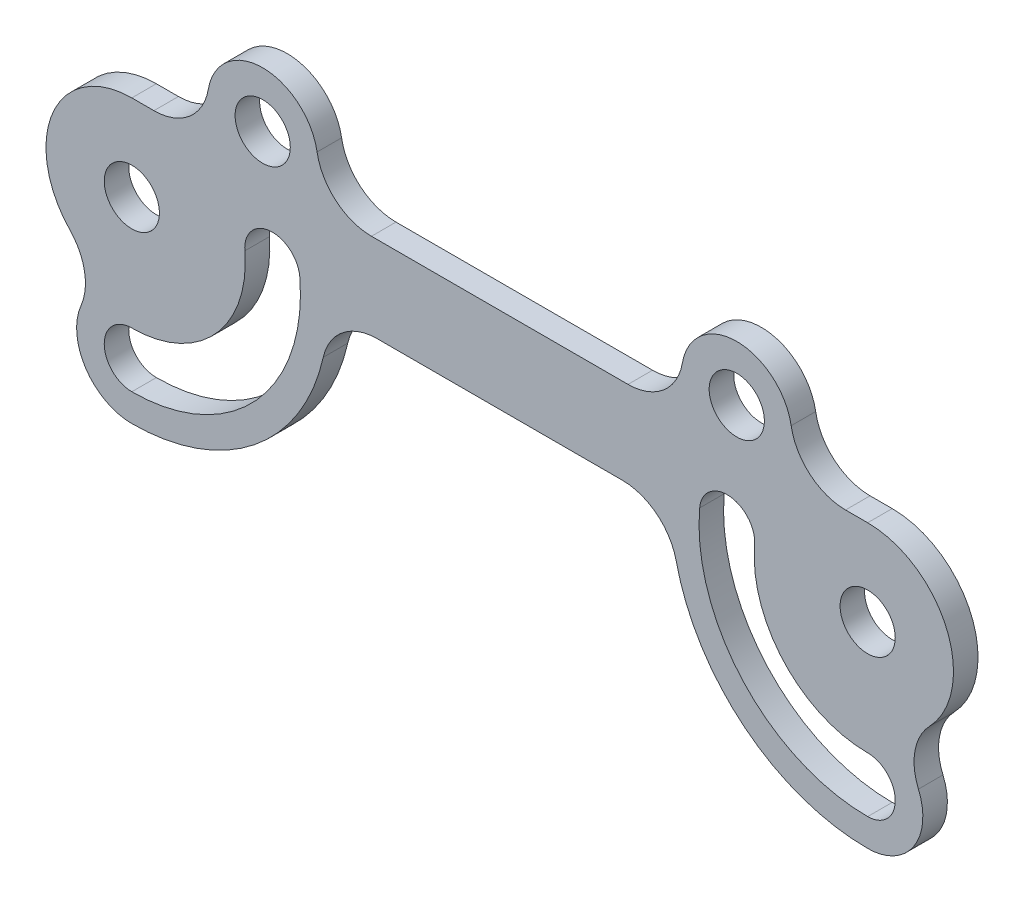
ISO-10303-21;
HEADER;
FILE_DESCRIPTION(('STEP AP214'),'2;1');
FILE_NAME('part.step','',(''),(''),'','','');
FILE_SCHEMA(('AUTOMOTIVE_DESIGN { 1 0 10303 214 1 1 1 1 }'));
ENDSEC;
DATA;
#1=APPLICATION_CONTEXT('core data for automotive mechanical design processes');
#2=APPLICATION_PROTOCOL_DEFINITION('international standard','automotive_design',2000,#1);
#3=PRODUCT_CONTEXT('',#1,'mechanical');
#4=PRODUCT('Part','Part','',(#3));
#5=PRODUCT_RELATED_PRODUCT_CATEGORY('part','',(#4));
#6=PRODUCT_DEFINITION_FORMATION('','',#4);
#7=PRODUCT_DEFINITION_CONTEXT('part definition',#1,'design');
#8=PRODUCT_DEFINITION('design','',#6,#7);
#9=PRODUCT_DEFINITION_SHAPE('','',#8);
#10=(LENGTH_UNIT() NAMED_UNIT(*) SI_UNIT(.MILLI.,.METRE.));
#11=(NAMED_UNIT(*) PLANE_ANGLE_UNIT() SI_UNIT($,.RADIAN.));
#12=(NAMED_UNIT(*) SI_UNIT($,.STERADIAN.) SOLID_ANGLE_UNIT());
#13=UNCERTAINTY_MEASURE_WITH_UNIT(LENGTH_MEASURE(1.E-05),#10,'distance_accuracy_value','');
#14=(GEOMETRIC_REPRESENTATION_CONTEXT(3) GLOBAL_UNCERTAINTY_ASSIGNED_CONTEXT((#13)) GLOBAL_UNIT_ASSIGNED_CONTEXT((#10,
#11,#12)) REPRESENTATION_CONTEXT('',''));
#15=CARTESIAN_POINT('',(0.,0.,0.));
#16=DIRECTION('',(0.,0.,1.));
#17=DIRECTION('',(1.,0.,0.));
#18=AXIS2_PLACEMENT_3D('',#15,#16,#17);
#19=CARTESIAN_POINT('',(0.,0.,1.5875));
#20=DIRECTION('',(0.,0.,-1.));
#21=DIRECTION('',(-1.,0.,0.));
#22=AXIS2_PLACEMENT_3D('',#19,#20,#21);
#23=CYLINDRICAL_SURFACE('',#22,7.3421875);
#24=CARTESIAN_POINT('',(0.,0.,0.));
#25=DIRECTION('',(0.,0.,1.));
#26=DIRECTION('',(1.,0.,0.));
#27=AXIS2_PLACEMENT_3D('',#24,#25,#26);
#28=CIRCLE('',#27,7.3421875);
#29=CARTESIAN_POINT('',(7.31424825989548,0.639913804955098,0.));
#30=VERTEX_POINT('',#29);
#31=CARTESIAN_POINT('',(0.,-7.3421875,0.));
#32=VERTEX_POINT('',#31);
#33=EDGE_CURVE('E351',#30,#32,#28,.F.);
#34=ORIENTED_EDGE('',*,*,#33,.F.);
#35=DIRECTION('',(0.,0.,-1.));
#36=VECTOR('',#35,1.);
#37=CARTESIAN_POINT('',(7.31424825989548,0.639913804955098,1.5875));
#38=LINE('',#37,#36);
#39=CARTESIAN_POINT('',(7.31424825989548,0.639913804955098,1.5875));
#40=VERTEX_POINT('',#39);
#41=EDGE_CURVE('E381',#40,#30,#38,.T.);
#42=ORIENTED_EDGE('',*,*,#41,.F.);
#43=CARTESIAN_POINT('',(0.,0.,1.5875));
#44=DIRECTION('',(0.,0.,1.));
#45=DIRECTION('',(1.,0.,0.));
#46=AXIS2_PLACEMENT_3D('',#43,#44,#45);
#47=CIRCLE('',#46,7.3421875);
#48=CARTESIAN_POINT('',(0.,-7.3421875,1.5875));
#49=VERTEX_POINT('',#48);
#50=EDGE_CURVE('E284',#40,#49,#47,.F.);
#51=ORIENTED_EDGE('',*,*,#50,.T.);
#52=DIRECTION('',(0.,0.,-1.));
#53=VECTOR('',#52,1.);
#54=CARTESIAN_POINT('',(0.,-7.3421875,1.5875));
#55=LINE('',#54,#53);
#56=EDGE_CURVE('E374',#49,#32,#55,.T.);
#57=ORIENTED_EDGE('',*,*,#56,.T.);
#58=EDGE_LOOP('',(#34,#42,#51,#57));
#59=FACE_BOUND('',#58,.T.);
#60=ADVANCED_FACE('F38',(#59),#23,.T.);
#61=CARTESIAN_POINT('',(9.09338972851871,0.7955685142685,1.5875));
#62=DIRECTION('',(0.,0.,-1.));
#63=DIRECTION('',(-1.,0.,0.));
#64=AXIS2_PLACEMENT_3D('',#61,#62,#63);
#65=CYLINDRICAL_SURFACE('',#64,1.7859375);
#66=CARTESIAN_POINT('',(9.09338972851871,0.7955685142685,0.));
#67=DIRECTION('',(0.,0.,1.));
#68=DIRECTION('',(1.,0.,0.));
#69=AXIS2_PLACEMENT_3D('',#66,#67,#68);
#70=CIRCLE('',#69,1.7859375);
#71=CARTESIAN_POINT('',(10.8725311971419,0.951223223581902,0.));
#72=VERTEX_POINT('',#71);
#73=EDGE_CURVE('E354',#72,#30,#70,.T.);
#74=ORIENTED_EDGE('',*,*,#73,.F.);
#75=DIRECTION('',(0.,0.,-1.));
#76=VECTOR('',#75,1.);
#77=CARTESIAN_POINT('',(10.8725311971419,0.951223223581902,1.5875));
#78=LINE('',#77,#76);
#79=CARTESIAN_POINT('',(10.8725311971419,0.951223223581902,1.5875));
#80=VERTEX_POINT('',#79);
#81=EDGE_CURVE('E379',#80,#72,#78,.T.);
#82=ORIENTED_EDGE('',*,*,#81,.F.);
#83=CARTESIAN_POINT('',(9.09338972851871,0.7955685142685,1.5875));
#84=DIRECTION('',(0.,0.,1.));
#85=DIRECTION('',(1.,0.,0.));
#86=AXIS2_PLACEMENT_3D('',#83,#84,#85);
#87=CIRCLE('',#86,1.7859375);
#88=EDGE_CURVE('E287',#80,#40,#87,.T.);
#89=ORIENTED_EDGE('',*,*,#88,.T.);
#90=ORIENTED_EDGE('',*,*,#41,.T.);
#91=EDGE_LOOP('',(#74,#82,#89,#90));
#92=FACE_BOUND('',#91,.T.);
#93=ADVANCED_FACE('F557',(#92),#65,.F.);
#94=CARTESIAN_POINT('',(0.,0.,1.5875));
#95=DIRECTION('',(0.,0.,-1.));
#96=DIRECTION('',(-1.,0.,0.));
#97=AXIS2_PLACEMENT_3D('',#94,#95,#96);
#98=CYLINDRICAL_SURFACE('',#97,10.9140625);
#99=CARTESIAN_POINT('',(0.,0.,0.));
#100=DIRECTION('',(0.,0.,1.));
#101=DIRECTION('',(1.,0.,0.));
#102=AXIS2_PLACEMENT_3D('',#99,#100,#101);
#103=CIRCLE('',#102,10.9140625);
#104=CARTESIAN_POINT('',(0.,-10.9140625,0.));
#105=VERTEX_POINT('',#104);
#106=EDGE_CURVE('E357',#105,#72,#103,.T.);
#107=ORIENTED_EDGE('',*,*,#106,.F.);
#108=DIRECTION('',(0.,0.,-1.));
#109=VECTOR('',#108,1.);
#110=CARTESIAN_POINT('',(0.,-10.9140625,1.5875));
#111=LINE('',#110,#109);
#112=CARTESIAN_POINT('',(0.,-10.9140625,1.5875));
#113=VERTEX_POINT('',#112);
#114=EDGE_CURVE('E376',#113,#105,#111,.T.);
#115=ORIENTED_EDGE('',*,*,#114,.F.);
#116=CARTESIAN_POINT('',(0.,0.,1.5875));
#117=DIRECTION('',(0.,0.,1.));
#118=DIRECTION('',(1.,0.,0.));
#119=AXIS2_PLACEMENT_3D('',#116,#117,#118);
#120=CIRCLE('',#119,10.9140625);
#121=EDGE_CURVE('E290',#113,#80,#120,.T.);
#122=ORIENTED_EDGE('',*,*,#121,.T.);
#123=ORIENTED_EDGE('',*,*,#81,.T.);
#124=EDGE_LOOP('',(#107,#115,#122,#123));
#125=FACE_BOUND('',#124,.T.);
#126=ADVANCED_FACE('F563',(#125),#98,.F.);
#127=CARTESIAN_POINT('',(47.625,-9.12812499999998,1.5875));
#128=DIRECTION('',(0.,0.,-1.));
#129=DIRECTION('',(-1.,0.,0.));
#130=AXIS2_PLACEMENT_3D('',#127,#128,#129);
#131=CYLINDRICAL_SURFACE('',#130,3.57187499999999);
#132=CARTESIAN_POINT('',(47.625,-9.12812499999998,0.));
#133=DIRECTION('',(0.,0.,1.));
#134=DIRECTION('',(1.,0.,0.));
#135=AXIS2_PLACEMENT_3D('',#132,#133,#134);
#136=CIRCLE('',#135,3.57187499999999);
#137=CARTESIAN_POINT('',(47.625,-12.7,0.));
#138=VERTEX_POINT('',#137);
#139=CARTESIAN_POINT('',(50.9120584223335,-7.73043478260869,0.));
#140=VERTEX_POINT('',#139);
#141=EDGE_CURVE('E318',#138,#140,#136,.T.);
#142=ORIENTED_EDGE('',*,*,#141,.T.);
#143=DIRECTION('',(0.,0.,-1.));
#144=VECTOR('',#143,1.);
#145=CARTESIAN_POINT('',(50.9120584223335,-7.73043478260869,1.5875));
#146=LINE('',#145,#144);
#147=CARTESIAN_POINT('',(50.9120584223335,-7.73043478260869,1.5875));
#148=VERTEX_POINT('',#147);
#149=EDGE_CURVE('E399',#140,#148,#146,.F.);
#150=ORIENTED_EDGE('',*,*,#149,.T.);
#151=CARTESIAN_POINT('',(47.625,-9.12812499999998,1.5875));
#152=DIRECTION('',(0.,0.,1.));
#153=DIRECTION('',(1.,0.,0.));
#154=AXIS2_PLACEMENT_3D('',#151,#152,#153);
#155=CIRCLE('',#154,3.57187499999999);
#156=CARTESIAN_POINT('',(47.625,-12.7,1.5875));
#157=VERTEX_POINT('',#156);
#158=EDGE_CURVE('E253',#157,#148,#155,.T.);
#159=ORIENTED_EDGE('',*,*,#158,.F.);
#160=DIRECTION('',(0.,0.,-1.));
#161=VECTOR('',#160,1.);
#162=CARTESIAN_POINT('',(47.625,-12.7,1.5875));
#163=LINE('',#162,#161);
#164=EDGE_CURVE('E244',#157,#138,#163,.T.);
#165=ORIENTED_EDGE('',*,*,#164,.T.);
#166=EDGE_LOOP('',(#142,#150,#159,#165));
#167=FACE_BOUND('',#166,.T.);
#168=ADVANCED_FACE('F513',(#167),#131,.T.);
#169=CARTESIAN_POINT('',(47.625,0.,1.5875));
#170=DIRECTION('',(0.,0.,-1.));
#171=DIRECTION('',(-1.,0.,0.));
#172=AXIS2_PLACEMENT_3D('',#169,#170,#171);
#173=CYLINDRICAL_SURFACE('',#172,5.55625);
#174=CARTESIAN_POINT('',(47.625,0.,1.5875));
#175=DIRECTION('',(0.,0.,1.));
#176=DIRECTION('',(1.,0.,0.));
#177=AXIS2_PLACEMENT_3D('',#174,#175,#176);
#178=CIRCLE('',#177,5.55625);
#179=CARTESIAN_POINT('',(51.6266363402321,-3.8547140831758,1.5875));
#180=VERTEX_POINT('',#179);
#181=CARTESIAN_POINT('',(47.625,5.55625,1.5875));
#182=VERTEX_POINT('',#181);
#183=EDGE_CURVE('E256',#180,#182,#178,.T.);
#184=ORIENTED_EDGE('',*,*,#183,.F.);
#185=DIRECTION('',(0.,0.,-1.));
#186=VECTOR('',#185,1.);
#187=CARTESIAN_POINT('',(51.6266363402321,-3.8547140831758,1.5875));
#188=LINE('',#187,#186);
#189=CARTESIAN_POINT('',(51.6266363402321,-3.8547140831758,0.));
#190=VERTEX_POINT('',#189);
#191=EDGE_CURVE('E383',#180,#190,#188,.T.);
#192=ORIENTED_EDGE('',*,*,#191,.T.);
#193=CARTESIAN_POINT('',(47.625,0.,0.));
#194=DIRECTION('',(0.,0.,1.));
#195=DIRECTION('',(1.,0.,0.));
#196=AXIS2_PLACEMENT_3D('',#193,#194,#195);
#197=CIRCLE('',#196,5.55625);
#198=CARTESIAN_POINT('',(47.625,5.55625,0.));
#199=VERTEX_POINT('',#198);
#200=EDGE_CURVE('E321',#190,#199,#197,.T.);
#201=ORIENTED_EDGE('',*,*,#200,.T.);
#202=DIRECTION('',(0.,0.,-1.));
#203=VECTOR('',#202,1.);
#204=CARTESIAN_POINT('',(47.625,5.55625,1.5875));
#205=LINE('',#204,#203);
#206=EDGE_CURVE('E377',#182,#199,#205,.T.);
#207=ORIENTED_EDGE('',*,*,#206,.F.);
#208=EDGE_LOOP('',(#184,#192,#201,#207));
#209=FACE_BOUND('',#208,.T.);
#210=ADVANCED_FACE('F522',(#209),#173,.T.);
#211=CARTESIAN_POINT('',(0.,5.55625,1.5875));
#212=DIRECTION('',(0.,1.,0.));
#213=DIRECTION('',(0.,0.,1.));
#214=AXIS2_PLACEMENT_3D('',#211,#212,#213);
#215=PLANE('',#214);
#216=DIRECTION('',(1.,0.,0.));
#217=VECTOR('',#216,1.);
#218=CARTESIAN_POINT('',(0.,5.55625,0.));
#219=LINE('',#218,#217);
#220=CARTESIAN_POINT('',(46.1937270237768,5.55625,0.));
#221=VERTEX_POINT('',#220);
#222=EDGE_CURVE('E324',#221,#199,#219,.T.);
#223=ORIENTED_EDGE('',*,*,#222,.F.);
#224=DIRECTION('',(0.,0.,-1.));
#225=VECTOR('',#224,1.);
#226=CARTESIAN_POINT('',(46.1937270237768,5.55625,1.5875));
#227=LINE('',#226,#225);
#228=CARTESIAN_POINT('',(46.1937270237768,5.55625,1.5875));
#229=VERTEX_POINT('',#228);
#230=EDGE_CURVE('E406',#221,#229,#227,.F.);
#231=ORIENTED_EDGE('',*,*,#230,.T.);
#232=DIRECTION('',(1.,0.,0.));
#233=VECTOR('',#232,1.);
#234=CARTESIAN_POINT('',(0.,5.55625,1.5875));
#235=LINE('',#234,#233);
#236=EDGE_CURVE('E259',#229,#182,#235,.T.);
#237=ORIENTED_EDGE('',*,*,#236,.T.);
#238=ORIENTED_EDGE('',*,*,#206,.T.);
#239=EDGE_LOOP('',(#223,#231,#237,#238));
#240=FACE_BOUND('',#239,.T.);
#241=ADVANCED_FACE('F528',(#240),#215,.T.);
#242=CARTESIAN_POINT('',(39.1542291087349,7.9121343887614,1.5875));
#243=DIRECTION('',(0.,0.,-1.));
#244=DIRECTION('',(-1.,0.,0.));
#245=AXIS2_PLACEMENT_3D('',#242,#243,#244);
#246=CYLINDRICAL_SURFACE('',#245,3.57187500000001);
#247=CARTESIAN_POINT('',(39.1542291087349,7.9121343887614,1.5875));
#248=DIRECTION('',(0.,0.,1.));
#249=DIRECTION('',(1.,0.,0.));
#250=AXIS2_PLACEMENT_3D('',#247,#248,#249);
#251=CIRCLE('',#250,3.57187500000001);
#252=CARTESIAN_POINT('',(42.6739780662559,8.5201296943807,1.5875));
#253=VERTEX_POINT('',#252);
#254=CARTESIAN_POINT('',(35.6344801512139,8.5201296943807,1.5875));
#255=VERTEX_POINT('',#254);
#256=EDGE_CURVE('E261',#253,#255,#251,.T.);
#257=ORIENTED_EDGE('',*,*,#256,.F.);
#258=DIRECTION('',(0.,0.,-1.));
#259=VECTOR('',#258,1.);
#260=CARTESIAN_POINT('',(42.6739780662559,8.5201296943807,1.5875));
#261=LINE('',#260,#259);
#262=CARTESIAN_POINT('',(42.6739780662559,8.5201296943807,0.));
#263=VERTEX_POINT('',#262);
#264=EDGE_CURVE('E403',#253,#263,#261,.T.);
#265=ORIENTED_EDGE('',*,*,#264,.T.);
#266=CARTESIAN_POINT('',(39.1542291087349,7.9121343887614,0.));
#267=DIRECTION('',(0.,0.,1.));
#268=DIRECTION('',(1.,0.,0.));
#269=AXIS2_PLACEMENT_3D('',#266,#267,#268);
#270=CIRCLE('',#269,3.57187500000001);
#271=CARTESIAN_POINT('',(35.6344801512139,8.5201296943807,0.));
#272=VERTEX_POINT('',#271);
#273=EDGE_CURVE('E326',#263,#272,#270,.T.);
#274=ORIENTED_EDGE('',*,*,#273,.T.);
#275=DIRECTION('',(0.,0.,-1.));
#276=VECTOR('',#275,1.);
#277=CARTESIAN_POINT('',(35.6344801512139,8.5201296943807,1.5875));
#278=LINE('',#277,#276);
#279=EDGE_CURVE('E401',#272,#255,#278,.F.);
#280=ORIENTED_EDGE('',*,*,#279,.T.);
#281=EDGE_LOOP('',(#257,#265,#274,#280));
#282=FACE_BOUND('',#281,.T.);
#283=ADVANCED_FACE('F537',(#282),#246,.T.);
#284=CARTESIAN_POINT('',(0.,5.55625,1.5875));
#285=DIRECTION('',(0.,1.,0.));
#286=DIRECTION('',(0.,0.,1.));
#287=AXIS2_PLACEMENT_3D('',#284,#285,#286);
#288=PLANE('',#287);
#289=DIRECTION('',(1.,0.,0.));
#290=VECTOR('',#289,1.);
#291=CARTESIAN_POINT('',(0.,5.55625,1.5875));
#292=LINE('',#291,#290);
#293=CARTESIAN_POINT('',(15.510268806307,5.55625,1.5875));
#294=VERTEX_POINT('',#293);
#295=CARTESIAN_POINT('',(32.114731193693,5.55625,1.5875));
#296=VERTEX_POINT('',#295);
#297=EDGE_CURVE('E264',#294,#296,#292,.T.);
#298=ORIENTED_EDGE('',*,*,#297,.T.);
#299=DIRECTION('',(0.,0.,-1.));
#300=VECTOR('',#299,1.);
#301=CARTESIAN_POINT('',(32.114731193693,5.55625,1.5875));
#302=LINE('',#301,#300);
#303=CARTESIAN_POINT('',(32.114731193693,5.55625,0.));
#304=VERTEX_POINT('',#303);
#305=EDGE_CURVE('E418',#296,#304,#302,.T.);
#306=ORIENTED_EDGE('',*,*,#305,.T.);
#307=DIRECTION('',(1.,0.,0.));
#308=VECTOR('',#307,1.);
#309=CARTESIAN_POINT('',(0.,5.55625,0.));
#310=LINE('',#309,#308);
#311=CARTESIAN_POINT('',(15.510268806307,5.55625,0.));
#312=VERTEX_POINT('',#311);
#313=EDGE_CURVE('E329',#312,#304,#310,.T.);
#314=ORIENTED_EDGE('',*,*,#313,.F.);
#315=DIRECTION('',(0.,0.,-1.));
#316=VECTOR('',#315,1.);
#317=CARTESIAN_POINT('',(15.510268806307,5.55625,1.5875));
#318=LINE('',#317,#316);
#319=EDGE_CURVE('E416',#312,#294,#318,.F.);
#320=ORIENTED_EDGE('',*,*,#319,.T.);
#321=EDGE_LOOP('',(#298,#306,#314,#320));
#322=FACE_BOUND('',#321,.T.);
#323=ADVANCED_FACE('F545',(#322),#288,.T.);
#324=CARTESIAN_POINT('',(8.4707708912651,7.9121343887614,1.5875));
#325=DIRECTION('',(0.,0.,-1.));
#326=DIRECTION('',(-1.,0.,0.));
#327=AXIS2_PLACEMENT_3D('',#324,#325,#326);
#328=CYLINDRICAL_SURFACE('',#327,3.571875);
#329=CARTESIAN_POINT('',(8.4707708912651,7.9121343887614,1.5875));
#330=DIRECTION('',(0.,0.,1.));
#331=DIRECTION('',(1.,0.,0.));
#332=AXIS2_PLACEMENT_3D('',#329,#330,#331);
#333=CIRCLE('',#332,3.571875);
#334=CARTESIAN_POINT('',(11.9905198487861,8.5201296943807,1.5875));
#335=VERTEX_POINT('',#334);
#336=CARTESIAN_POINT('',(4.95102193374414,8.5201296943807,1.5875));
#337=VERTEX_POINT('',#336);
#338=EDGE_CURVE('E267',#335,#337,#333,.T.);
#339=ORIENTED_EDGE('',*,*,#338,.F.);
#340=DIRECTION('',(0.,0.,-1.));
#341=VECTOR('',#340,1.);
#342=CARTESIAN_POINT('',(11.9905198487861,8.5201296943807,1.5875));
#343=LINE('',#342,#341);
#344=CARTESIAN_POINT('',(11.9905198487861,8.5201296943807,0.));
#345=VERTEX_POINT('',#344);
#346=EDGE_CURVE('E430',#335,#345,#343,.T.);
#347=ORIENTED_EDGE('',*,*,#346,.T.);
#348=CARTESIAN_POINT('',(8.4707708912651,7.9121343887614,0.));
#349=DIRECTION('',(0.,0.,1.));
#350=DIRECTION('',(1.,0.,0.));
#351=AXIS2_PLACEMENT_3D('',#348,#349,#350);
#352=CIRCLE('',#351,3.571875);
#353=CARTESIAN_POINT('',(4.95102193374414,8.5201296943807,0.));
#354=VERTEX_POINT('',#353);
#355=EDGE_CURVE('E332',#345,#354,#352,.T.);
#356=ORIENTED_EDGE('',*,*,#355,.T.);
#357=DIRECTION('',(0.,0.,-1.));
#358=VECTOR('',#357,1.);
#359=CARTESIAN_POINT('',(4.95102193374414,8.5201296943807,1.5875));
#360=LINE('',#359,#358);
#361=EDGE_CURVE('E428',#354,#337,#360,.F.);
#362=ORIENTED_EDGE('',*,*,#361,.T.);
#363=EDGE_LOOP('',(#339,#347,#356,#362));
#364=FACE_BOUND('',#363,.T.);
#365=ADVANCED_FACE('F471',(#364),#328,.T.);
#366=CARTESIAN_POINT('',(0.,5.55625,1.5875));
#367=DIRECTION('',(0.,1.,0.));
#368=DIRECTION('',(0.,0.,1.));
#369=AXIS2_PLACEMENT_3D('',#366,#367,#368);
#370=PLANE('',#369);
#371=DIRECTION('',(1.,0.,0.));
#372=VECTOR('',#371,1.);
#373=CARTESIAN_POINT('',(0.,5.55625,1.5875));
#374=LINE('',#373,#372);
#375=CARTESIAN_POINT('',(0.,5.55625,1.5875));
#376=VERTEX_POINT('',#375);
#377=CARTESIAN_POINT('',(1.43127297622318,5.55625,1.5875));
#378=VERTEX_POINT('',#377);
#379=EDGE_CURVE('E269',#376,#378,#374,.T.);
#380=ORIENTED_EDGE('',*,*,#379,.T.);
#381=DIRECTION('',(0.,0.,-1.));
#382=VECTOR('',#381,1.);
#383=CARTESIAN_POINT('',(1.43127297622318,5.55625,1.5875));
#384=LINE('',#383,#382);
#385=CARTESIAN_POINT('',(1.43127297622318,5.55625,0.));
#386=VERTEX_POINT('',#385);
#387=EDGE_CURVE('E433',#378,#386,#384,.T.);
#388=ORIENTED_EDGE('',*,*,#387,.T.);
#389=DIRECTION('',(1.,0.,0.));
#390=VECTOR('',#389,1.);
#391=CARTESIAN_POINT('',(0.,5.55625,0.));
#392=LINE('',#391,#390);
#393=CARTESIAN_POINT('',(0.,5.55625,0.));
#394=VERTEX_POINT('',#393);
#395=EDGE_CURVE('E335',#394,#386,#392,.T.);
#396=ORIENTED_EDGE('',*,*,#395,.F.);
#397=DIRECTION('',(0.,0.,-1.));
#398=VECTOR('',#397,1.);
#399=CARTESIAN_POINT('',(0.,5.55625,1.5875));
#400=LINE('',#399,#398);
#401=EDGE_CURVE('E389',#376,#394,#400,.T.);
#402=ORIENTED_EDGE('',*,*,#401,.F.);
#403=EDGE_LOOP('',(#380,#388,#396,#402));
#404=FACE_BOUND('',#403,.T.);
#405=ADVANCED_FACE('F474',(#404),#370,.T.);
#406=CARTESIAN_POINT('',(0.,0.,1.5875));
#407=DIRECTION('',(0.,0.,-1.));
#408=DIRECTION('',(-1.,0.,0.));
#409=AXIS2_PLACEMENT_3D('',#406,#407,#408);
#410=CYLINDRICAL_SURFACE('',#409,5.55625);
#411=CARTESIAN_POINT('',(0.,0.,0.));
#412=DIRECTION('',(0.,0.,1.));
#413=DIRECTION('',(1.,0.,0.));
#414=AXIS2_PLACEMENT_3D('',#411,#412,#413);
#415=CIRCLE('',#414,5.55625);
#416=CARTESIAN_POINT('',(-4.0016363402321,-3.8547140831758,0.));
#417=VERTEX_POINT('',#416);
#418=EDGE_CURVE('E338',#394,#417,#415,.T.);
#419=ORIENTED_EDGE('',*,*,#418,.T.);
#420=DIRECTION('',(0.,0.,-1.));
#421=VECTOR('',#420,1.);
#422=CARTESIAN_POINT('',(-4.0016363402321,-3.8547140831758,1.5875));
#423=LINE('',#422,#421);
#424=CARTESIAN_POINT('',(-4.0016363402321,-3.8547140831758,1.5875));
#425=VERTEX_POINT('',#424);
#426=EDGE_CURVE('E426',#417,#425,#423,.F.);
#427=ORIENTED_EDGE('',*,*,#426,.T.);
#428=CARTESIAN_POINT('',(0.,0.,1.5875));
#429=DIRECTION('',(0.,0.,1.));
#430=DIRECTION('',(1.,0.,0.));
#431=AXIS2_PLACEMENT_3D('',#428,#429,#430);
#432=CIRCLE('',#431,5.55625);
#433=EDGE_CURVE('E271',#376,#425,#432,.T.);
#434=ORIENTED_EDGE('',*,*,#433,.F.);
#435=ORIENTED_EDGE('',*,*,#401,.T.);
#436=EDGE_LOOP('',(#419,#427,#434,#435));
#437=FACE_BOUND('',#436,.T.);
#438=ADVANCED_FACE('F579',(#437),#410,.T.);
#439=CARTESIAN_POINT('',(0.,-9.128125,1.5875));
#440=DIRECTION('',(0.,0.,-1.));
#441=DIRECTION('',(-1.,0.,0.));
#442=AXIS2_PLACEMENT_3D('',#439,#440,#441);
#443=CYLINDRICAL_SURFACE('',#442,3.571875);
#444=CARTESIAN_POINT('',(0.,-9.128125,1.5875));
#445=DIRECTION('',(0.,0.,1.));
#446=DIRECTION('',(1.,0.,0.));
#447=AXIS2_PLACEMENT_3D('',#444,#445,#446);
#448=CIRCLE('',#447,3.571875);
#449=CARTESIAN_POINT('',(-3.28705842233351,-7.73043478260869,1.5875));
#450=VERTEX_POINT('',#449);
#451=CARTESIAN_POINT('',(0.,-12.7,1.5875));
#452=VERTEX_POINT('',#451);
#453=EDGE_CURVE('E274',#450,#452,#448,.T.);
#454=ORIENTED_EDGE('',*,*,#453,.F.);
#455=DIRECTION('',(0.,0.,-1.));
#456=VECTOR('',#455,1.);
#457=CARTESIAN_POINT('',(-3.28705842233351,-7.73043478260869,1.5875));
#458=LINE('',#457,#456);
#459=CARTESIAN_POINT('',(-3.28705842233351,-7.73043478260869,0.));
#460=VERTEX_POINT('',#459);
#461=EDGE_CURVE('E423',#450,#460,#458,.T.);
#462=ORIENTED_EDGE('',*,*,#461,.T.);
#463=CARTESIAN_POINT('',(0.,-9.128125,0.));
#464=DIRECTION('',(0.,0.,1.));
#465=DIRECTION('',(1.,0.,0.));
#466=AXIS2_PLACEMENT_3D('',#463,#464,#465);
#467=CIRCLE('',#466,3.571875);
#468=CARTESIAN_POINT('',(0.,-12.7,0.));
#469=VERTEX_POINT('',#468);
#470=EDGE_CURVE('E341',#460,#469,#467,.T.);
#471=ORIENTED_EDGE('',*,*,#470,.T.);
#472=DIRECTION('',(0.,0.,-1.));
#473=VECTOR('',#472,1.);
#474=CARTESIAN_POINT('',(0.,-12.7,1.5875));
#475=LINE('',#474,#473);
#476=EDGE_CURVE('E386',#452,#469,#475,.T.);
#477=ORIENTED_EDGE('',*,*,#476,.F.);
#478=EDGE_LOOP('',(#454,#462,#471,#477));
#479=FACE_BOUND('',#478,.T.);
#480=ADVANCED_FACE('F486',(#479),#443,.T.);
#481=CARTESIAN_POINT('',(0.,0.,1.5875));
#482=DIRECTION('',(0.,0.,-1.));
#483=DIRECTION('',(-1.,0.,0.));
#484=AXIS2_PLACEMENT_3D('',#481,#482,#483);
#485=CYLINDRICAL_SURFACE('',#484,12.7);
#486=CARTESIAN_POINT('',(0.,0.,0.));
#487=DIRECTION('',(0.,0.,1.));
#488=DIRECTION('',(1.,0.,0.));
#489=AXIS2_PLACEMENT_3D('',#486,#487,#488);
#490=CIRCLE('',#489,12.7);
#491=CARTESIAN_POINT('',(12.390243902439,-2.78780487804878,0.));
#492=VERTEX_POINT('',#491);
#493=EDGE_CURVE('E343',#469,#492,#490,.T.);
#494=ORIENTED_EDGE('',*,*,#493,.T.);
#495=DIRECTION('',(0.,0.,-1.));
#496=VECTOR('',#495,1.);
#497=CARTESIAN_POINT('',(12.390243902439,-2.78780487804878,1.5875));
#498=LINE('',#497,#496);
#499=CARTESIAN_POINT('',(12.390243902439,-2.78780487804878,1.5875));
#500=VERTEX_POINT('',#499);
#501=EDGE_CURVE('E421',#492,#500,#498,.F.);
#502=ORIENTED_EDGE('',*,*,#501,.T.);
#503=CARTESIAN_POINT('',(0.,0.,1.5875));
#504=DIRECTION('',(0.,0.,1.));
#505=DIRECTION('',(1.,0.,0.));
#506=AXIS2_PLACEMENT_3D('',#503,#504,#505);
#507=CIRCLE('',#506,12.7);
#508=EDGE_CURVE('E276',#452,#500,#507,.T.);
#509=ORIENTED_EDGE('',*,*,#508,.F.);
#510=ORIENTED_EDGE('',*,*,#476,.T.);
#511=EDGE_LOOP('',(#494,#502,#509,#510));
#512=FACE_BOUND('',#511,.T.);
#513=ADVANCED_FACE('F492',(#512),#485,.T.);
#514=CARTESIAN_POINT('',(0.,0.,1.5875));
#515=DIRECTION('',(0.,1.,0.));
#516=DIRECTION('',(0.,0.,1.));
#517=AXIS2_PLACEMENT_3D('',#514,#515,#516);
#518=PLANE('',#517);
#519=DIRECTION('',(1.,0.,0.));
#520=VECTOR('',#519,1.);
#521=CARTESIAN_POINT('',(0.,0.,0.));
#522=LINE('',#521,#520);
#523=CARTESIAN_POINT('',(15.875,0.,0.));
#524=VERTEX_POINT('',#523);
#525=CARTESIAN_POINT('',(31.75,0.,0.));
#526=VERTEX_POINT('',#525);
#527=EDGE_CURVE('E346',#524,#526,#522,.T.);
#528=ORIENTED_EDGE('',*,*,#527,.T.);
#529=DIRECTION('',(0.,0.,1.));
#530=VECTOR('',#529,1.);
#531=CARTESIAN_POINT('',(31.75,0.,1.5875));
#532=LINE('',#531,#530);
#533=CARTESIAN_POINT('',(31.75,0.,1.5875));
#534=VERTEX_POINT('',#533);
#535=EDGE_CURVE('E414',#526,#534,#532,.T.);
#536=ORIENTED_EDGE('',*,*,#535,.T.);
#537=DIRECTION('',(1.,0.,0.));
#538=VECTOR('',#537,1.);
#539=CARTESIAN_POINT('',(0.,0.,1.5875));
#540=LINE('',#539,#538);
#541=CARTESIAN_POINT('',(15.875,0.,1.5875));
#542=VERTEX_POINT('',#541);
#543=EDGE_CURVE('E279',#542,#534,#540,.T.);
#544=ORIENTED_EDGE('',*,*,#543,.F.);
#545=DIRECTION('',(0.,0.,1.));
#546=VECTOR('',#545,1.);
#547=CARTESIAN_POINT('',(15.875,0.,0.));
#548=LINE('',#547,#546);
#549=EDGE_CURVE('E411',#542,#524,#548,.F.);
#550=ORIENTED_EDGE('',*,*,#549,.T.);
#551=EDGE_LOOP('',(#528,#536,#544,#550));
#552=FACE_BOUND('',#551,.T.);
#553=ADVANCED_FACE('F501',(#552),#518,.F.);
#554=CARTESIAN_POINT('',(47.625,0.,1.5875));
#555=DIRECTION('',(0.,0.,-1.));
#556=DIRECTION('',(-1.,0.,0.));
#557=AXIS2_PLACEMENT_3D('',#554,#555,#556);
#558=CYLINDRICAL_SURFACE('',#557,7.3421875);
#559=CARTESIAN_POINT('',(47.625,0.,0.));
#560=DIRECTION('',(0.,0.,1.));
#561=DIRECTION('',(1.,0.,0.));
#562=AXIS2_PLACEMENT_3D('',#559,#560,#561);
#563=CIRCLE('',#562,7.3421875);
#564=CARTESIAN_POINT('',(40.3107517401045,0.639913804955097,0.));
#565=VERTEX_POINT('',#564);
#566=CARTESIAN_POINT('',(47.625,-7.34218749999998,0.));
#567=VERTEX_POINT('',#566);
#568=EDGE_CURVE('E240',#565,#567,#563,.T.);
#569=ORIENTED_EDGE('',*,*,#568,.T.);
#570=DIRECTION('',(0.,0.,-1.));
#571=VECTOR('',#570,1.);
#572=CARTESIAN_POINT('',(47.625,-7.34218749999998,1.5875));
#573=LINE('',#572,#571);
#574=CARTESIAN_POINT('',(47.625,-7.34218749999998,1.5875));
#575=VERTEX_POINT('',#574);
#576=EDGE_CURVE('E237',#575,#567,#573,.T.);
#577=ORIENTED_EDGE('',*,*,#576,.F.);
#578=CARTESIAN_POINT('',(47.625,0.,1.5875));
#579=DIRECTION('',(0.,0.,1.));
#580=DIRECTION('',(1.,0.,0.));
#581=AXIS2_PLACEMENT_3D('',#578,#579,#580);
#582=CIRCLE('',#581,7.3421875);
#583=CARTESIAN_POINT('',(40.3107517401045,0.639913804955097,1.5875));
#584=VERTEX_POINT('',#583);
#585=EDGE_CURVE('E224',#584,#575,#582,.T.);
#586=ORIENTED_EDGE('',*,*,#585,.F.);
#587=DIRECTION('',(0.,0.,-1.));
#588=VECTOR('',#587,1.);
#589=CARTESIAN_POINT('',(40.3107517401045,0.639913804955097,1.5875));
#590=LINE('',#589,#588);
#591=EDGE_CURVE('E308',#584,#565,#590,.T.);
#592=ORIENTED_EDGE('',*,*,#591,.T.);
#593=EDGE_LOOP('',(#569,#577,#586,#592));
#594=FACE_BOUND('',#593,.T.);
#595=ADVANCED_FACE('F238',(#594),#558,.T.);
#596=CARTESIAN_POINT('',(47.625,-9.12812499999998,1.5875));
#597=DIRECTION('',(0.,0.,-1.));
#598=DIRECTION('',(-1.,0.,0.));
#599=AXIS2_PLACEMENT_3D('',#596,#597,#598);
#600=CYLINDRICAL_SURFACE('',#599,1.7859375);
#601=CARTESIAN_POINT('',(47.625,-9.12812499999998,0.));
#602=DIRECTION('',(0.,0.,1.));
#603=DIRECTION('',(1.,0.,0.));
#604=AXIS2_PLACEMENT_3D('',#601,#602,#603);
#605=CIRCLE('',#604,1.7859375);
#606=CARTESIAN_POINT('',(47.625,-10.9140625,0.));
#607=VERTEX_POINT('',#606);
#608=EDGE_CURVE('E310',#607,#567,#605,.T.);
#609=ORIENTED_EDGE('',*,*,#608,.F.);
#610=DIRECTION('',(0.,0.,-1.));
#611=VECTOR('',#610,1.);
#612=CARTESIAN_POINT('',(47.625,-10.9140625,1.5875));
#613=LINE('',#612,#611);
#614=CARTESIAN_POINT('',(47.625,-10.9140625,1.5875));
#615=VERTEX_POINT('',#614);
#616=EDGE_CURVE('E245',#615,#607,#613,.T.);
#617=ORIENTED_EDGE('',*,*,#616,.F.);
#618=CARTESIAN_POINT('',(47.625,-9.12812499999998,1.5875));
#619=DIRECTION('',(0.,0.,1.));
#620=DIRECTION('',(1.,0.,0.));
#621=AXIS2_PLACEMENT_3D('',#618,#619,#620);
#622=CIRCLE('',#621,1.7859375);
#623=EDGE_CURVE('E229',#615,#575,#622,.T.);
#624=ORIENTED_EDGE('',*,*,#623,.T.);
#625=ORIENTED_EDGE('',*,*,#576,.T.);
#626=EDGE_LOOP('',(#609,#617,#624,#625));
#627=FACE_BOUND('',#626,.T.);
#628=ADVANCED_FACE('F247',(#627),#600,.F.);
#629=CARTESIAN_POINT('',(47.625,0.,1.5875));
#630=DIRECTION('',(0.,0.,-1.));
#631=DIRECTION('',(-1.,0.,0.));
#632=AXIS2_PLACEMENT_3D('',#629,#630,#631);
#633=CYLINDRICAL_SURFACE('',#632,10.9140625);
#634=CARTESIAN_POINT('',(47.625,0.,0.));
#635=DIRECTION('',(0.,0.,1.));
#636=DIRECTION('',(1.,0.,0.));
#637=AXIS2_PLACEMENT_3D('',#634,#635,#636);
#638=CIRCLE('',#637,10.9140625);
#639=CARTESIAN_POINT('',(36.7524688028581,0.951223223581902,0.));
#640=VERTEX_POINT('',#639);
#641=EDGE_CURVE('E312',#640,#607,#638,.T.);
#642=ORIENTED_EDGE('',*,*,#641,.F.);
#643=DIRECTION('',(0.,0.,-1.));
#644=VECTOR('',#643,1.);
#645=CARTESIAN_POINT('',(36.7524688028581,0.951223223581902,1.5875));
#646=LINE('',#645,#644);
#647=CARTESIAN_POINT('',(36.7524688028581,0.951223223581902,1.5875));
#648=VERTEX_POINT('',#647);
#649=EDGE_CURVE('E394',#648,#640,#646,.T.);
#650=ORIENTED_EDGE('',*,*,#649,.F.);
#651=CARTESIAN_POINT('',(47.625,0.,1.5875));
#652=DIRECTION('',(0.,0.,1.));
#653=DIRECTION('',(1.,0.,0.));
#654=AXIS2_PLACEMENT_3D('',#651,#652,#653);
#655=CIRCLE('',#654,10.9140625);
#656=EDGE_CURVE('E248',#648,#615,#655,.T.);
#657=ORIENTED_EDGE('',*,*,#656,.T.);
#658=ORIENTED_EDGE('',*,*,#616,.T.);
#659=EDGE_LOOP('',(#642,#650,#657,#658));
#660=FACE_BOUND('',#659,.T.);
#661=ADVANCED_FACE('F600',(#660),#633,.F.);
#662=CARTESIAN_POINT('',(47.625,0.,1.5875));
#663=DIRECTION('',(0.,0.,-1.));
#664=DIRECTION('',(-1.,0.,0.));
#665=AXIS2_PLACEMENT_3D('',#662,#663,#664);
#666=CYLINDRICAL_SURFACE('',#665,1.7859375);
#667=CARTESIAN_POINT('',(47.625,0.,1.5875));
#668=DIRECTION('',(0.,0.,1.));
#669=DIRECTION('',(1.,0.,0.));
#670=AXIS2_PLACEMENT_3D('',#667,#668,#669);
#671=CIRCLE('',#670,1.7859375);
#672=CARTESIAN_POINT('',(49.4109375,0.,1.5875));
#673=VERTEX_POINT('',#672);
#674=EDGE_CURVE('E302',#673,#673,#671,.T.);
#675=ORIENTED_EDGE('',*,*,#674,.T.);
#676=EDGE_LOOP('',(#675));
#677=FACE_BOUND('',#676,.T.);
#678=CARTESIAN_POINT('',(47.625,0.,0.));
#679=DIRECTION('',(0.,0.,1.));
#680=DIRECTION('',(1.,0.,0.));
#681=AXIS2_PLACEMENT_3D('',#678,#679,#680);
#682=CIRCLE('',#681,1.7859375);
#683=CARTESIAN_POINT('',(49.4109375,0.,0.));
#684=VERTEX_POINT('',#683);
#685=EDGE_CURVE('E369',#684,#684,#682,.T.);
#686=ORIENTED_EDGE('',*,*,#685,.F.);
#687=EDGE_LOOP('',(#686));
#688=FACE_BOUND('',#687,.T.);
#689=ADVANCED_FACE('F603',(#677,#688),#666,.F.);
#690=CARTESIAN_POINT('',(8.4707708912651,7.9121343887614,1.5875));
#691=DIRECTION('',(0.,0.,-1.));
#692=DIRECTION('',(-1.,0.,0.));
#693=AXIS2_PLACEMENT_3D('',#690,#691,#692);
#694=CYLINDRICAL_SURFACE('',#693,1.7859375);
#695=CARTESIAN_POINT('',(8.4707708912651,7.9121343887614,1.5875));
#696=DIRECTION('',(0.,0.,1.));
#697=DIRECTION('',(1.,0.,0.));
#698=AXIS2_PLACEMENT_3D('',#695,#696,#697);
#699=CIRCLE('',#698,1.7859375);
#700=CARTESIAN_POINT('',(10.2567083912651,7.9121343887614,1.5875));
#701=VERTEX_POINT('',#700);
#702=EDGE_CURVE('E299',#701,#701,#699,.T.);
#703=ORIENTED_EDGE('',*,*,#702,.T.);
#704=EDGE_LOOP('',(#703));
#705=FACE_BOUND('',#704,.T.);
#706=CARTESIAN_POINT('',(8.4707708912651,7.9121343887614,0.));
#707=DIRECTION('',(0.,0.,1.));
#708=DIRECTION('',(1.,0.,0.));
#709=AXIS2_PLACEMENT_3D('',#706,#707,#708);
#710=CIRCLE('',#709,1.7859375);
#711=CARTESIAN_POINT('',(10.2567083912651,7.9121343887614,0.));
#712=VERTEX_POINT('',#711);
#713=EDGE_CURVE('E366',#712,#712,#710,.T.);
#714=ORIENTED_EDGE('',*,*,#713,.F.);
#715=EDGE_LOOP('',(#714));
#716=FACE_BOUND('',#715,.T.);
#717=ADVANCED_FACE('F792',(#705,#716),#694,.F.);
#718=CARTESIAN_POINT('',(0.,0.,1.5875));
#719=DIRECTION('',(0.,0.,-1.));
#720=DIRECTION('',(-1.,0.,0.));
#721=AXIS2_PLACEMENT_3D('',#718,#719,#720);
#722=CYLINDRICAL_SURFACE('',#721,1.7859375);
#723=CARTESIAN_POINT('',(0.,0.,1.5875));
#724=DIRECTION('',(0.,0.,1.));
#725=DIRECTION('',(1.,0.,0.));
#726=AXIS2_PLACEMENT_3D('',#723,#724,#725);
#727=CIRCLE('',#726,1.7859375);
#728=CARTESIAN_POINT('',(1.7859375,0.,1.5875));
#729=VERTEX_POINT('',#728);
#730=EDGE_CURVE('E296',#729,#729,#727,.T.);
#731=ORIENTED_EDGE('',*,*,#730,.T.);
#732=EDGE_LOOP('',(#731));
#733=FACE_BOUND('',#732,.T.);
#734=CARTESIAN_POINT('',(0.,0.,0.));
#735=DIRECTION('',(0.,0.,1.));
#736=DIRECTION('',(1.,0.,0.));
#737=AXIS2_PLACEMENT_3D('',#734,#735,#736);
#738=CIRCLE('',#737,1.7859375);
#739=CARTESIAN_POINT('',(1.7859375,0.,0.));
#740=VERTEX_POINT('',#739);
#741=EDGE_CURVE('E363',#740,#740,#738,.T.);
#742=ORIENTED_EDGE('',*,*,#741,.F.);
#743=EDGE_LOOP('',(#742));
#744=FACE_BOUND('',#743,.T.);
#745=ADVANCED_FACE('F782',(#733,#744),#722,.F.);
#746=CARTESIAN_POINT('',(0.,-9.128125,1.5875));
#747=DIRECTION('',(0.,0.,-1.));
#748=DIRECTION('',(-1.,0.,0.));
#749=AXIS2_PLACEMENT_3D('',#746,#747,#748);
#750=CYLINDRICAL_SURFACE('',#749,1.7859375);
#751=CARTESIAN_POINT('',(0.,-9.128125,0.));
#752=DIRECTION('',(0.,0.,1.));
#753=DIRECTION('',(1.,0.,0.));
#754=AXIS2_PLACEMENT_3D('',#751,#752,#753);
#755=CIRCLE('',#754,1.7859375);
#756=EDGE_CURVE('E360',#32,#105,#755,.T.);
#757=ORIENTED_EDGE('',*,*,#756,.F.);
#758=ORIENTED_EDGE('',*,*,#56,.F.);
#759=CARTESIAN_POINT('',(0.,-9.128125,1.5875));
#760=DIRECTION('',(0.,0.,1.));
#761=DIRECTION('',(1.,0.,0.));
#762=AXIS2_PLACEMENT_3D('',#759,#760,#761);
#763=CIRCLE('',#762,1.7859375);
#764=EDGE_CURVE('E293',#49,#113,#763,.T.);
#765=ORIENTED_EDGE('',*,*,#764,.T.);
#766=ORIENTED_EDGE('',*,*,#114,.T.);
#767=EDGE_LOOP('',(#757,#758,#765,#766));
#768=FACE_BOUND('',#767,.T.);
#769=ADVANCED_FACE('F572',(#768),#750,.F.);
#770=CARTESIAN_POINT('',(47.625,0.,1.5875));
#771=DIRECTION('',(0.,0.,-1.));
#772=DIRECTION('',(-1.,0.,0.));
#773=AXIS2_PLACEMENT_3D('',#770,#771,#772);
#774=CYLINDRICAL_SURFACE('',#773,12.7);
#775=CARTESIAN_POINT('',(47.625,0.,1.5875));
#776=DIRECTION('',(0.,0.,1.));
#777=DIRECTION('',(1.,0.,0.));
#778=AXIS2_PLACEMENT_3D('',#775,#776,#777);
#779=CIRCLE('',#778,12.7);
#780=CARTESIAN_POINT('',(35.234756097561,-2.78780487804878,1.5875));
#781=VERTEX_POINT('',#780);
#782=EDGE_CURVE('E282',#781,#157,#779,.T.);
#783=ORIENTED_EDGE('',*,*,#782,.F.);
#784=DIRECTION('',(0.,0.,-1.));
#785=VECTOR('',#784,1.);
#786=CARTESIAN_POINT('',(35.234756097561,-2.78780487804878,1.5875));
#787=LINE('',#786,#785);
#788=CARTESIAN_POINT('',(35.234756097561,-2.78780487804878,0.));
#789=VERTEX_POINT('',#788);
#790=EDGE_CURVE('E408',#781,#789,#787,.T.);
#791=ORIENTED_EDGE('',*,*,#790,.T.);
#792=CARTESIAN_POINT('',(47.625,0.,0.));
#793=DIRECTION('',(0.,0.,1.));
#794=DIRECTION('',(1.,0.,0.));
#795=AXIS2_PLACEMENT_3D('',#792,#793,#794);
#796=CIRCLE('',#795,12.7);
#797=EDGE_CURVE('E349',#789,#138,#796,.T.);
#798=ORIENTED_EDGE('',*,*,#797,.T.);
#799=ORIENTED_EDGE('',*,*,#164,.F.);
#800=EDGE_LOOP('',(#783,#791,#798,#799));
#801=FACE_BOUND('',#800,.T.);
#802=ADVANCED_FACE('F509',(#801),#774,.T.);
#803=CARTESIAN_POINT('',(38.5316102714813,0.795568514268499,1.5875));
#804=DIRECTION('',(0.,0.,-1.));
#805=DIRECTION('',(-1.,0.,0.));
#806=AXIS2_PLACEMENT_3D('',#803,#804,#805);
#807=CYLINDRICAL_SURFACE('',#806,1.7859375);
#808=CARTESIAN_POINT('',(38.5316102714813,0.795568514268499,0.));
#809=DIRECTION('',(0.,0.,1.));
#810=DIRECTION('',(1.,0.,0.));
#811=AXIS2_PLACEMENT_3D('',#808,#809,#810);
#812=CIRCLE('',#811,1.7859375);
#813=EDGE_CURVE('E315',#565,#640,#812,.T.);
#814=ORIENTED_EDGE('',*,*,#813,.F.);
#815=ORIENTED_EDGE('',*,*,#591,.F.);
#816=CARTESIAN_POINT('',(38.5316102714813,0.795568514268499,1.5875));
#817=DIRECTION('',(0.,0.,1.));
#818=DIRECTION('',(1.,0.,0.));
#819=AXIS2_PLACEMENT_3D('',#816,#817,#818);
#820=CIRCLE('',#819,1.7859375);
#821=EDGE_CURVE('E232',#584,#648,#820,.T.);
#822=ORIENTED_EDGE('',*,*,#821,.T.);
#823=ORIENTED_EDGE('',*,*,#649,.T.);
#824=EDGE_LOOP('',(#814,#815,#822,#823));
#825=FACE_BOUND('',#824,.T.);
#826=ADVANCED_FACE('F571',(#825),#807,.F.);
#827=CARTESIAN_POINT('',(39.1542291087349,7.9121343887614,1.5875));
#828=DIRECTION('',(0.,0.,-1.));
#829=DIRECTION('',(-1.,0.,0.));
#830=AXIS2_PLACEMENT_3D('',#827,#828,#829);
#831=CYLINDRICAL_SURFACE('',#830,1.78593750000001);
#832=CARTESIAN_POINT('',(39.1542291087349,7.9121343887614,1.5875));
#833=DIRECTION('',(0.,0.,1.));
#834=DIRECTION('',(1.,0.,0.));
#835=AXIS2_PLACEMENT_3D('',#832,#833,#834);
#836=CIRCLE('',#835,1.78593750000001);
#837=CARTESIAN_POINT('',(40.9401666087349,7.9121343887614,1.5875));
#838=VERTEX_POINT('',#837);
#839=EDGE_CURVE('E305',#838,#838,#836,.T.);
#840=ORIENTED_EDGE('',*,*,#839,.T.);
#841=EDGE_LOOP('',(#840));
#842=FACE_BOUND('',#841,.T.);
#843=CARTESIAN_POINT('',(39.1542291087349,7.9121343887614,0.));
#844=DIRECTION('',(0.,0.,1.));
#845=DIRECTION('',(1.,0.,0.));
#846=AXIS2_PLACEMENT_3D('',#843,#844,#845);
#847=CIRCLE('',#846,1.78593750000001);
#848=CARTESIAN_POINT('',(40.9401666087349,7.9121343887614,0.));
#849=VERTEX_POINT('',#848);
#850=EDGE_CURVE('E234',#849,#849,#847,.T.);
#851=ORIENTED_EDGE('',*,*,#850,.F.);
#852=EDGE_LOOP('',(#851));
#853=FACE_BOUND('',#852,.T.);
#854=ADVANCED_FACE('F598',(#842,#853),#831,.F.);
#855=CARTESIAN_POINT('',(0.,0.,1.5875));
#856=DIRECTION('',(0.,0.,1.));
#857=DIRECTION('',(1.,0.,0.));
#858=AXIS2_PLACEMENT_3D('',#855,#856,#857);
#859=PLANE('',#858);
#860=ORIENTED_EDGE('',*,*,#585,.T.);
#861=ORIENTED_EDGE('',*,*,#623,.F.);
#862=ORIENTED_EDGE('',*,*,#656,.F.);
#863=ORIENTED_EDGE('',*,*,#821,.F.);
#864=EDGE_LOOP('',(#860,#861,#862,#863));
#865=FACE_BOUND('',#864,.T.);
#866=ORIENTED_EDGE('',*,*,#158,.T.);
#867=CARTESIAN_POINT('',(54.199116844667,-6.3327445652174,1.5875));
#868=DIRECTION('',(0.,0.,1.));
#869=DIRECTION('',(1.,0.,0.));
#870=AXIS2_PLACEMENT_3D('',#867,#868,#869);
#871=CIRCLE('',#870,3.571875);
#872=EDGE_CURVE('E437',#148,#180,#871,.F.);
#873=ORIENTED_EDGE('',*,*,#872,.T.);
#874=ORIENTED_EDGE('',*,*,#183,.T.);
#875=ORIENTED_EDGE('',*,*,#236,.F.);
#876=CARTESIAN_POINT('',(46.1937270237768,9.128125,1.5875));
#877=DIRECTION('',(0.,0.,1.));
#878=DIRECTION('',(1.,0.,0.));
#879=AXIS2_PLACEMENT_3D('',#876,#877,#878);
#880=CIRCLE('',#879,3.571875);
#881=EDGE_CURVE('E441',#229,#253,#880,.F.);
#882=ORIENTED_EDGE('',*,*,#881,.T.);
#883=ORIENTED_EDGE('',*,*,#256,.T.);
#884=CARTESIAN_POINT('',(32.114731193693,9.128125,1.5875));
#885=DIRECTION('',(0.,0.,1.));
#886=DIRECTION('',(1.,0.,0.));
#887=AXIS2_PLACEMENT_3D('',#884,#885,#886);
#888=CIRCLE('',#887,3.571875);
#889=EDGE_CURVE('E449',#255,#296,#888,.F.);
#890=ORIENTED_EDGE('',*,*,#889,.T.);
#891=ORIENTED_EDGE('',*,*,#297,.F.);
#892=CARTESIAN_POINT('',(15.510268806307,9.128125,1.5875));
#893=DIRECTION('',(0.,0.,1.));
#894=DIRECTION('',(1.,0.,0.));
#895=AXIS2_PLACEMENT_3D('',#892,#893,#894);
#896=CIRCLE('',#895,3.571875);
#897=EDGE_CURVE('E461',#294,#335,#896,.F.);
#898=ORIENTED_EDGE('',*,*,#897,.T.);
#899=ORIENTED_EDGE('',*,*,#338,.T.);
#900=CARTESIAN_POINT('',(1.43127297622318,9.128125,1.5875));
#901=DIRECTION('',(0.,0.,1.));
#902=DIRECTION('',(1.,0.,0.));
#903=AXIS2_PLACEMENT_3D('',#900,#901,#902);
#904=CIRCLE('',#903,3.571875);
#905=EDGE_CURVE('E11',#337,#378,#904,.F.);
#906=ORIENTED_EDGE('',*,*,#905,.T.);
#907=ORIENTED_EDGE('',*,*,#379,.F.);
#908=ORIENTED_EDGE('',*,*,#433,.T.);
#909=CARTESIAN_POINT('',(-6.57411684466701,-6.33274456521739,1.5875));
#910=DIRECTION('',(0.,0.,1.));
#911=DIRECTION('',(1.,0.,0.));
#912=AXIS2_PLACEMENT_3D('',#909,#910,#911);
#913=CIRCLE('',#912,3.571875);
#914=EDGE_CURVE('E457',#425,#450,#913,.F.);
#915=ORIENTED_EDGE('',*,*,#914,.T.);
#916=ORIENTED_EDGE('',*,*,#453,.T.);
#917=ORIENTED_EDGE('',*,*,#508,.T.);
#918=CARTESIAN_POINT('',(15.875,-3.571875,1.5875));
#919=DIRECTION('',(0.,0.,1.));
#920=DIRECTION('',(1.,0.,0.));
#921=AXIS2_PLACEMENT_3D('',#918,#919,#920);
#922=CIRCLE('',#921,3.571875);
#923=EDGE_CURVE('E453',#500,#542,#922,.F.);
#924=ORIENTED_EDGE('',*,*,#923,.T.);
#925=ORIENTED_EDGE('',*,*,#543,.T.);
#926=CARTESIAN_POINT('',(31.75,-3.571875,1.5875));
#927=DIRECTION('',(0.,0.,1.));
#928=DIRECTION('',(1.,0.,0.));
#929=AXIS2_PLACEMENT_3D('',#926,#927,#928);
#930=CIRCLE('',#929,3.571875);
#931=EDGE_CURVE('E445',#534,#781,#930,.F.);
#932=ORIENTED_EDGE('',*,*,#931,.T.);
#933=ORIENTED_EDGE('',*,*,#782,.T.);
#934=EDGE_LOOP('',(#866,#873,#874,#875,#882,#883,#890,#891,#898,#899,#906,#907,#908,#915,#916,
#917,#924,#925,#932,#933));
#935=FACE_BOUND('',#934,.T.);
#936=ORIENTED_EDGE('',*,*,#50,.F.);
#937=ORIENTED_EDGE('',*,*,#88,.F.);
#938=ORIENTED_EDGE('',*,*,#121,.F.);
#939=ORIENTED_EDGE('',*,*,#764,.F.);
#940=EDGE_LOOP('',(#936,#937,#938,#939));
#941=FACE_BOUND('',#940,.T.);
#942=ORIENTED_EDGE('',*,*,#730,.F.);
#943=EDGE_LOOP('',(#942));
#944=FACE_BOUND('',#943,.T.);
#945=ORIENTED_EDGE('',*,*,#702,.F.);
#946=EDGE_LOOP('',(#945));
#947=FACE_BOUND('',#946,.T.);
#948=ORIENTED_EDGE('',*,*,#674,.F.);
#949=EDGE_LOOP('',(#948));
#950=FACE_BOUND('',#949,.T.);
#951=ORIENTED_EDGE('',*,*,#839,.F.);
#952=EDGE_LOOP('',(#951));
#953=FACE_BOUND('',#952,.T.);
#954=ADVANCED_FACE('F226',(#865,#935,#941,#944,#947,#950,#953),#859,.T.);
#955=CARTESIAN_POINT('',(0.,0.,0.));
#956=DIRECTION('',(0.,0.,1.));
#957=DIRECTION('',(1.,0.,0.));
#958=AXIS2_PLACEMENT_3D('',#955,#956,#957);
#959=PLANE('',#958);
#960=ORIENTED_EDGE('',*,*,#568,.F.);
#961=ORIENTED_EDGE('',*,*,#813,.T.);
#962=ORIENTED_EDGE('',*,*,#641,.T.);
#963=ORIENTED_EDGE('',*,*,#608,.T.);
#964=EDGE_LOOP('',(#960,#961,#962,#963));
#965=FACE_BOUND('',#964,.T.);
#966=ORIENTED_EDGE('',*,*,#141,.F.);
#967=ORIENTED_EDGE('',*,*,#797,.F.);
#968=CARTESIAN_POINT('',(31.75,-3.571875,0.));
#969=DIRECTION('',(0.,0.,1.));
#970=DIRECTION('',(1.,0.,0.));
#971=AXIS2_PLACEMENT_3D('',#968,#969,#970);
#972=CIRCLE('',#971,3.571875);
#973=EDGE_CURVE('E443',#789,#526,#972,.T.);
#974=ORIENTED_EDGE('',*,*,#973,.T.);
#975=ORIENTED_EDGE('',*,*,#527,.F.);
#976=CARTESIAN_POINT('',(15.875,-3.571875,0.));
#977=DIRECTION('',(0.,0.,1.));
#978=DIRECTION('',(1.,0.,0.));
#979=AXIS2_PLACEMENT_3D('',#976,#977,#978);
#980=CIRCLE('',#979,3.571875);
#981=EDGE_CURVE('E451',#524,#492,#980,.T.);
#982=ORIENTED_EDGE('',*,*,#981,.T.);
#983=ORIENTED_EDGE('',*,*,#493,.F.);
#984=ORIENTED_EDGE('',*,*,#470,.F.);
#985=CARTESIAN_POINT('',(-6.57411684466701,-6.33274456521739,0.));
#986=DIRECTION('',(0.,0.,1.));
#987=DIRECTION('',(1.,0.,0.));
#988=AXIS2_PLACEMENT_3D('',#985,#986,#987);
#989=CIRCLE('',#988,3.571875);
#990=EDGE_CURVE('E455',#460,#417,#989,.T.);
#991=ORIENTED_EDGE('',*,*,#990,.T.);
#992=ORIENTED_EDGE('',*,*,#418,.F.);
#993=ORIENTED_EDGE('',*,*,#395,.T.);
#994=CARTESIAN_POINT('',(1.43127297622318,9.128125,0.));
#995=DIRECTION('',(0.,0.,1.));
#996=DIRECTION('',(1.,0.,0.));
#997=AXIS2_PLACEMENT_3D('',#994,#995,#996);
#998=CIRCLE('',#997,3.571875);
#999=EDGE_CURVE('E46',#386,#354,#998,.T.);
#1000=ORIENTED_EDGE('',*,*,#999,.T.);
#1001=ORIENTED_EDGE('',*,*,#355,.F.);
#1002=CARTESIAN_POINT('',(15.510268806307,9.128125,0.));
#1003=DIRECTION('',(0.,0.,1.));
#1004=DIRECTION('',(1.,0.,0.));
#1005=AXIS2_PLACEMENT_3D('',#1002,#1003,#1004);
#1006=CIRCLE('',#1005,3.571875);
#1007=EDGE_CURVE('E459',#345,#312,#1006,.T.);
#1008=ORIENTED_EDGE('',*,*,#1007,.T.);
#1009=ORIENTED_EDGE('',*,*,#313,.T.);
#1010=CARTESIAN_POINT('',(32.114731193693,9.128125,0.));
#1011=DIRECTION('',(0.,0.,1.));
#1012=DIRECTION('',(1.,0.,0.));
#1013=AXIS2_PLACEMENT_3D('',#1010,#1011,#1012);
#1014=CIRCLE('',#1013,3.571875);
#1015=EDGE_CURVE('E447',#304,#272,#1014,.T.);
#1016=ORIENTED_EDGE('',*,*,#1015,.T.);
#1017=ORIENTED_EDGE('',*,*,#273,.F.);
#1018=CARTESIAN_POINT('',(46.1937270237768,9.128125,0.));
#1019=DIRECTION('',(0.,0.,1.));
#1020=DIRECTION('',(1.,0.,0.));
#1021=AXIS2_PLACEMENT_3D('',#1018,#1019,#1020);
#1022=CIRCLE('',#1021,3.571875);
#1023=EDGE_CURVE('E439',#263,#221,#1022,.T.);
#1024=ORIENTED_EDGE('',*,*,#1023,.T.);
#1025=ORIENTED_EDGE('',*,*,#222,.T.);
#1026=ORIENTED_EDGE('',*,*,#200,.F.);
#1027=CARTESIAN_POINT('',(54.199116844667,-6.3327445652174,0.));
#1028=DIRECTION('',(0.,0.,1.));
#1029=DIRECTION('',(1.,0.,0.));
#1030=AXIS2_PLACEMENT_3D('',#1027,#1028,#1029);
#1031=CIRCLE('',#1030,3.571875);
#1032=EDGE_CURVE('E435',#190,#140,#1031,.T.);
#1033=ORIENTED_EDGE('',*,*,#1032,.T.);
#1034=EDGE_LOOP('',(#966,#967,#974,#975,#982,#983,#984,#991,#992,#993,#1000,#1001,#1008,#1009,
#1016,#1017,#1024,#1025,#1026,#1033));
#1035=FACE_BOUND('',#1034,.T.);
#1036=ORIENTED_EDGE('',*,*,#33,.T.);
#1037=ORIENTED_EDGE('',*,*,#756,.T.);
#1038=ORIENTED_EDGE('',*,*,#106,.T.);
#1039=ORIENTED_EDGE('',*,*,#73,.T.);
#1040=EDGE_LOOP('',(#1036,#1037,#1038,#1039));
#1041=FACE_BOUND('',#1040,.T.);
#1042=ORIENTED_EDGE('',*,*,#741,.T.);
#1043=EDGE_LOOP('',(#1042));
#1044=FACE_BOUND('',#1043,.T.);
#1045=ORIENTED_EDGE('',*,*,#713,.T.);
#1046=EDGE_LOOP('',(#1045));
#1047=FACE_BOUND('',#1046,.T.);
#1048=ORIENTED_EDGE('',*,*,#685,.T.);
#1049=EDGE_LOOP('',(#1048));
#1050=FACE_BOUND('',#1049,.T.);
#1051=ORIENTED_EDGE('',*,*,#850,.T.);
#1052=EDGE_LOOP('',(#1051));
#1053=FACE_BOUND('',#1052,.T.);
#1054=ADVANCED_FACE('F465',(#965,#1035,#1041,#1044,#1047,#1050,#1053),#959,.F.);
#1055=CARTESIAN_POINT('',(54.199116844667,-6.3327445652174,1.5875));
#1056=DIRECTION('',(0.,0.,1.));
#1057=DIRECTION('',(1.,0.,0.));
#1058=AXIS2_PLACEMENT_3D('',#1055,#1056,#1057);
#1059=CYLINDRICAL_SURFACE('',#1058,3.571875);
#1060=ORIENTED_EDGE('',*,*,#872,.F.);
#1061=ORIENTED_EDGE('',*,*,#149,.F.);
#1062=ORIENTED_EDGE('',*,*,#1032,.F.);
#1063=ORIENTED_EDGE('',*,*,#191,.F.);
#1064=EDGE_LOOP('',(#1060,#1061,#1062,#1063));
#1065=FACE_BOUND('',#1064,.T.);
#1066=ADVANCED_FACE('F519',(#1065),#1059,.F.);
#1067=CARTESIAN_POINT('',(46.1937270237768,9.128125,1.5875));
#1068=DIRECTION('',(0.,0.,-1.));
#1069=DIRECTION('',(-1.,0.,0.));
#1070=AXIS2_PLACEMENT_3D('',#1067,#1068,#1069);
#1071=CYLINDRICAL_SURFACE('',#1070,3.571875);
#1072=ORIENTED_EDGE('',*,*,#881,.F.);
#1073=ORIENTED_EDGE('',*,*,#230,.F.);
#1074=ORIENTED_EDGE('',*,*,#1023,.F.);
#1075=ORIENTED_EDGE('',*,*,#264,.F.);
#1076=EDGE_LOOP('',(#1072,#1073,#1074,#1075));
#1077=FACE_BOUND('',#1076,.T.);
#1078=ADVANCED_FACE('F532',(#1077),#1071,.F.);
#1079=CARTESIAN_POINT('',(31.75,-3.571875,1.5875));
#1080=DIRECTION('',(0.,0.,-1.));
#1081=DIRECTION('',(-1.,0.,0.));
#1082=AXIS2_PLACEMENT_3D('',#1079,#1080,#1081);
#1083=CYLINDRICAL_SURFACE('',#1082,3.571875);
#1084=ORIENTED_EDGE('',*,*,#931,.F.);
#1085=ORIENTED_EDGE('',*,*,#535,.F.);
#1086=ORIENTED_EDGE('',*,*,#973,.F.);
#1087=ORIENTED_EDGE('',*,*,#790,.F.);
#1088=EDGE_LOOP('',(#1084,#1085,#1086,#1087));
#1089=FACE_BOUND('',#1088,.T.);
#1090=ADVANCED_FACE('F504',(#1089),#1083,.F.);
#1091=CARTESIAN_POINT('',(32.114731193693,9.128125,1.5875));
#1092=DIRECTION('',(0.,0.,-1.));
#1093=DIRECTION('',(-1.,0.,0.));
#1094=AXIS2_PLACEMENT_3D('',#1091,#1092,#1093);
#1095=CYLINDRICAL_SURFACE('',#1094,3.571875);
#1096=ORIENTED_EDGE('',*,*,#889,.F.);
#1097=ORIENTED_EDGE('',*,*,#279,.F.);
#1098=ORIENTED_EDGE('',*,*,#1015,.F.);
#1099=ORIENTED_EDGE('',*,*,#305,.F.);
#1100=EDGE_LOOP('',(#1096,#1097,#1098,#1099));
#1101=FACE_BOUND('',#1100,.T.);
#1102=ADVANCED_FACE('F540',(#1101),#1095,.F.);
#1103=CARTESIAN_POINT('',(15.875,-3.571875,1.5875));
#1104=DIRECTION('',(0.,0.,-1.));
#1105=DIRECTION('',(-1.,0.,0.));
#1106=AXIS2_PLACEMENT_3D('',#1103,#1104,#1105);
#1107=CYLINDRICAL_SURFACE('',#1106,3.571875);
#1108=ORIENTED_EDGE('',*,*,#923,.F.);
#1109=ORIENTED_EDGE('',*,*,#501,.F.);
#1110=ORIENTED_EDGE('',*,*,#981,.F.);
#1111=ORIENTED_EDGE('',*,*,#549,.F.);
#1112=EDGE_LOOP('',(#1108,#1109,#1110,#1111));
#1113=FACE_BOUND('',#1112,.T.);
#1114=ADVANCED_FACE('F496',(#1113),#1107,.F.);
#1115=CARTESIAN_POINT('',(-6.57411684466701,-6.33274456521739,1.5875));
#1116=DIRECTION('',(0.,0.,1.));
#1117=DIRECTION('',(1.,0.,0.));
#1118=AXIS2_PLACEMENT_3D('',#1115,#1116,#1117);
#1119=CYLINDRICAL_SURFACE('',#1118,3.571875);
#1120=ORIENTED_EDGE('',*,*,#914,.F.);
#1121=ORIENTED_EDGE('',*,*,#426,.F.);
#1122=ORIENTED_EDGE('',*,*,#990,.F.);
#1123=ORIENTED_EDGE('',*,*,#461,.F.);
#1124=EDGE_LOOP('',(#1120,#1121,#1122,#1123));
#1125=FACE_BOUND('',#1124,.T.);
#1126=ADVANCED_FACE('F483',(#1125),#1119,.F.);
#1127=CARTESIAN_POINT('',(15.510268806307,9.128125,1.5875));
#1128=DIRECTION('',(0.,0.,-1.));
#1129=DIRECTION('',(-1.,0.,0.));
#1130=AXIS2_PLACEMENT_3D('',#1127,#1128,#1129);
#1131=CYLINDRICAL_SURFACE('',#1130,3.571875);
#1132=ORIENTED_EDGE('',*,*,#897,.F.);
#1133=ORIENTED_EDGE('',*,*,#319,.F.);
#1134=ORIENTED_EDGE('',*,*,#1007,.F.);
#1135=ORIENTED_EDGE('',*,*,#346,.F.);
#1136=EDGE_LOOP('',(#1132,#1133,#1134,#1135));
#1137=FACE_BOUND('',#1136,.T.);
#1138=ADVANCED_FACE('F549',(#1137),#1131,.F.);
#1139=CARTESIAN_POINT('',(1.43127297622318,9.128125,1.5875));
#1140=DIRECTION('',(0.,0.,-1.));
#1141=DIRECTION('',(-1.,0.,0.));
#1142=AXIS2_PLACEMENT_3D('',#1139,#1140,#1141);
#1143=CYLINDRICAL_SURFACE('',#1142,3.571875);
#1144=ORIENTED_EDGE('',*,*,#905,.F.);
#1145=ORIENTED_EDGE('',*,*,#361,.F.);
#1146=ORIENTED_EDGE('',*,*,#999,.F.);
#1147=ORIENTED_EDGE('',*,*,#387,.F.);
#1148=EDGE_LOOP('',(#1144,#1145,#1146,#1147));
#1149=FACE_BOUND('',#1148,.T.);
#1150=ADVANCED_FACE('F40',(#1149),#1143,.F.);
#1151=CLOSED_SHELL('',(#60,#93,#126,#168,#210,#241,#283,#323,#365,#405,#438,#480,#513,#553,#595,
#628,#661,#689,#717,#745,#769,#802,#826,#854,#954,#1054,#1066,#1078,#1090,#1102,#1114,#1126,
#1138,#1150));
#1152=MANIFOLD_SOLID_BREP('B2',#1151);
#1153=ADVANCED_BREP_SHAPE_REPRESENTATION('',(#18,#1152),#14);
#1154=SHAPE_DEFINITION_REPRESENTATION(#9,#1153);
ENDSEC;
END-ISO-10303-21;
